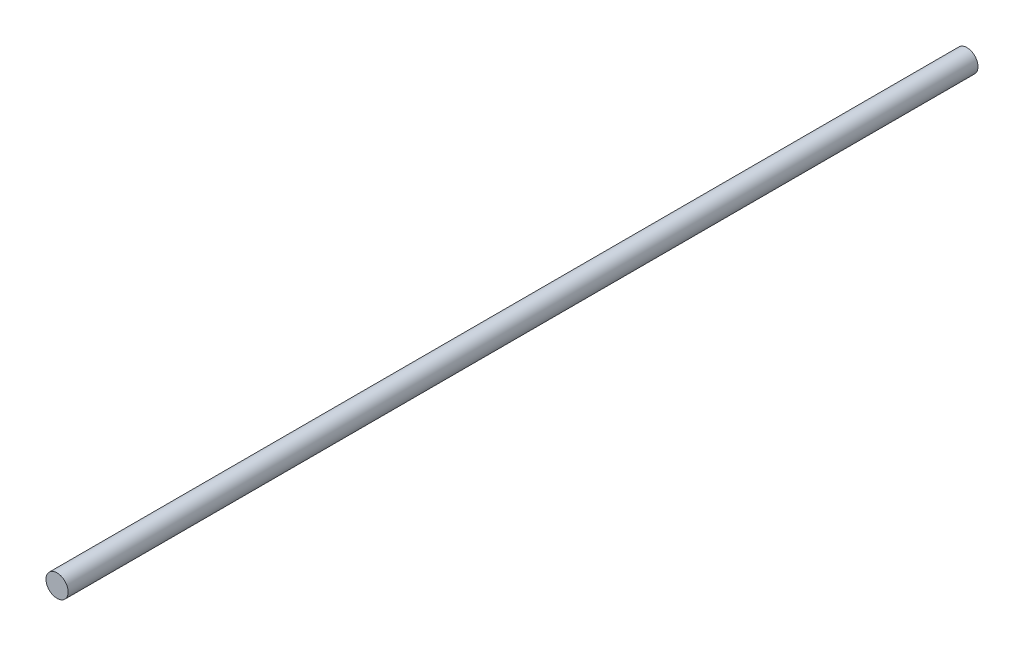
ISO-10303-21;
HEADER;
FILE_DESCRIPTION(('STEP AP214'),'2;1');
FILE_NAME('part.step','',(''),(''),'','','');
FILE_SCHEMA(('AUTOMOTIVE_DESIGN { 1 0 10303 214 1 1 1 1 }'));
ENDSEC;
DATA;
#1=APPLICATION_CONTEXT('core data for automotive mechanical design processes');
#2=APPLICATION_PROTOCOL_DEFINITION('international standard','automotive_design',2000,#1);
#3=PRODUCT_CONTEXT('',#1,'mechanical');
#4=PRODUCT('Part','Part','',(#3));
#5=PRODUCT_RELATED_PRODUCT_CATEGORY('part','',(#4));
#6=PRODUCT_DEFINITION_FORMATION('','',#4);
#7=PRODUCT_DEFINITION_CONTEXT('part definition',#1,'design');
#8=PRODUCT_DEFINITION('design','',#6,#7);
#9=PRODUCT_DEFINITION_SHAPE('','',#8);
#10=(LENGTH_UNIT() NAMED_UNIT(*) SI_UNIT(.MILLI.,.METRE.));
#11=(NAMED_UNIT(*) PLANE_ANGLE_UNIT() SI_UNIT($,.RADIAN.));
#12=(NAMED_UNIT(*) SI_UNIT($,.STERADIAN.) SOLID_ANGLE_UNIT());
#13=UNCERTAINTY_MEASURE_WITH_UNIT(LENGTH_MEASURE(1.E-05),#10,'distance_accuracy_value','');
#14=(GEOMETRIC_REPRESENTATION_CONTEXT(3) GLOBAL_UNCERTAINTY_ASSIGNED_CONTEXT((#13)) GLOBAL_UNIT_ASSIGNED_CONTEXT((#10,
#11,#12)) REPRESENTATION_CONTEXT('',''));
#15=CARTESIAN_POINT('',(0.,0.,0.));
#16=DIRECTION('',(0.,0.,1.));
#17=DIRECTION('',(1.,0.,0.));
#18=AXIS2_PLACEMENT_3D('',#15,#16,#17);
#19=CARTESIAN_POINT('',(0.,0.,530.));
#20=DIRECTION('',(0.,0.,-1.));
#21=DIRECTION('',(-1.,0.,0.));
#22=AXIS2_PLACEMENT_3D('',#19,#20,#21);
#23=CYLINDRICAL_SURFACE('',#22,6.45);
#24=CARTESIAN_POINT('',(0.,0.,530.));
#25=DIRECTION('',(0.,0.,1.));
#26=DIRECTION('',(1.,0.,0.));
#27=AXIS2_PLACEMENT_3D('',#24,#25,#26);
#28=CIRCLE('',#27,6.45);
#29=CARTESIAN_POINT('',(6.45,0.,530.));
#30=VERTEX_POINT('',#29);
#31=EDGE_CURVE('E10',#30,#30,#28,.T.);
#32=ORIENTED_EDGE('',*,*,#31,.F.);
#33=EDGE_LOOP('',(#32));
#34=FACE_BOUND('',#33,.T.);
#35=CARTESIAN_POINT('',(0.,0.,0.));
#36=DIRECTION('',(0.,0.,1.));
#37=DIRECTION('',(1.,0.,0.));
#38=AXIS2_PLACEMENT_3D('',#35,#36,#37);
#39=CIRCLE('',#38,6.45);
#40=CARTESIAN_POINT('',(6.45,0.,0.));
#41=VERTEX_POINT('',#40);
#42=EDGE_CURVE('E40',#41,#41,#39,.T.);
#43=ORIENTED_EDGE('',*,*,#42,.T.);
#44=EDGE_LOOP('',(#43));
#45=FACE_BOUND('',#44,.T.);
#46=ADVANCED_FACE('F37',(#34,#45),#23,.T.);
#47=CARTESIAN_POINT('',(0.,0.,530.));
#48=DIRECTION('',(0.,0.,1.));
#49=DIRECTION('',(1.,0.,0.));
#50=AXIS2_PLACEMENT_3D('',#47,#48,#49);
#51=PLANE('',#50);
#52=ORIENTED_EDGE('',*,*,#31,.T.);
#53=EDGE_LOOP('',(#52));
#54=FACE_BOUND('',#53,.T.);
#55=ADVANCED_FACE('F54',(#54),#51,.T.);
#56=CARTESIAN_POINT('',(0.,0.,0.));
#57=DIRECTION('',(0.,0.,1.));
#58=DIRECTION('',(1.,0.,0.));
#59=AXIS2_PLACEMENT_3D('',#56,#57,#58);
#60=PLANE('',#59);
#61=ORIENTED_EDGE('',*,*,#42,.F.);
#62=EDGE_LOOP('',(#61));
#63=FACE_BOUND('',#62,.T.);
#64=ADVANCED_FACE('F52',(#63),#60,.F.);
#65=CLOSED_SHELL('',(#46,#55,#64));
#66=MANIFOLD_SOLID_BREP('B2',#65);
#67=ADVANCED_BREP_SHAPE_REPRESENTATION('',(#18,#66),#14);
#68=SHAPE_DEFINITION_REPRESENTATION(#9,#67);
ENDSEC;
END-ISO-10303-21;
